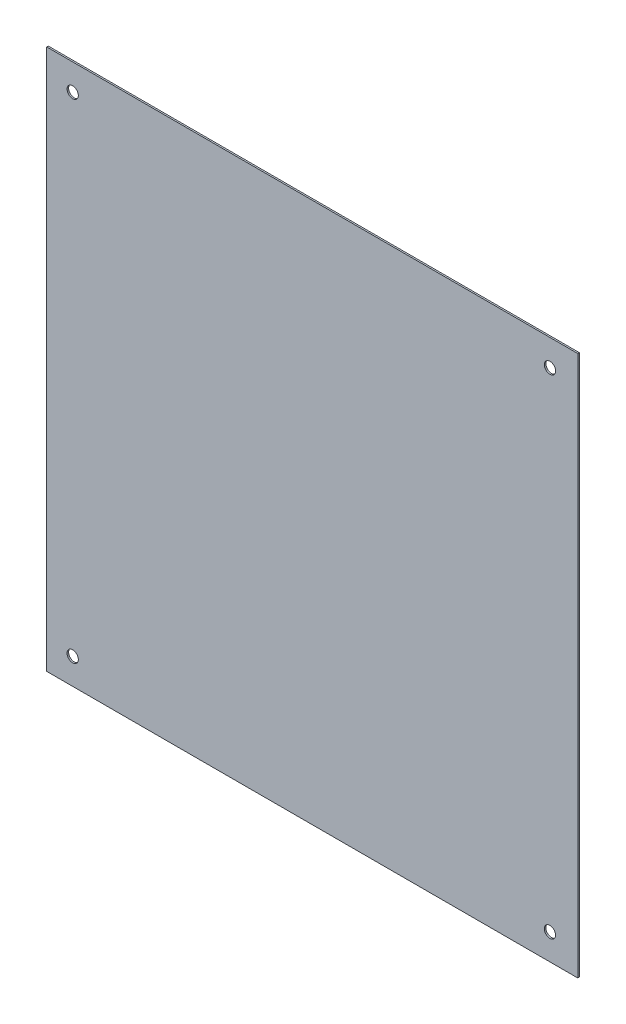
ISO-10303-21;
HEADER;
FILE_DESCRIPTION(('STEP AP214'),'2;1');
FILE_NAME('part.step','',(''),(''),'','','');
FILE_SCHEMA(('AUTOMOTIVE_DESIGN { 1 0 10303 214 1 1 1 1 }'));
ENDSEC;
DATA;
#1=APPLICATION_CONTEXT('core data for automotive mechanical design processes');
#2=APPLICATION_PROTOCOL_DEFINITION('international standard','automotive_design',2000,#1);
#3=PRODUCT_CONTEXT('',#1,'mechanical');
#4=PRODUCT('Part','Part','',(#3));
#5=PRODUCT_RELATED_PRODUCT_CATEGORY('part','',(#4));
#6=PRODUCT_DEFINITION_FORMATION('','',#4);
#7=PRODUCT_DEFINITION_CONTEXT('part definition',#1,'design');
#8=PRODUCT_DEFINITION('design','',#6,#7);
#9=PRODUCT_DEFINITION_SHAPE('','',#8);
#10=(LENGTH_UNIT() NAMED_UNIT(*) SI_UNIT(.MILLI.,.METRE.));
#11=(NAMED_UNIT(*) PLANE_ANGLE_UNIT() SI_UNIT($,.RADIAN.));
#12=(NAMED_UNIT(*) SI_UNIT($,.STERADIAN.) SOLID_ANGLE_UNIT());
#13=UNCERTAINTY_MEASURE_WITH_UNIT(LENGTH_MEASURE(1.E-05),#10,'distance_accuracy_value','');
#14=(GEOMETRIC_REPRESENTATION_CONTEXT(3) GLOBAL_UNCERTAINTY_ASSIGNED_CONTEXT((#13)) GLOBAL_UNIT_ASSIGNED_CONTEXT((#10,
#11,#12)) REPRESENTATION_CONTEXT('',''));
#15=CARTESIAN_POINT('',(0.,0.,0.));
#16=DIRECTION('',(0.,0.,1.));
#17=DIRECTION('',(1.,0.,0.));
#18=AXIS2_PLACEMENT_3D('',#15,#16,#17);
#19=CARTESIAN_POINT('',(70.738996397704,72.034498106688,0.));
#20=DIRECTION('',(0.,0.,-1.));
#21=DIRECTION('',(0.,-1.,0.));
#22=AXIS2_PLACEMENT_3D('',#19,#20,#21);
#23=PLANE('',#22);
#24=CARTESIAN_POINT('',(134.,137.,0.));
#25=DIRECTION('',(0.,0.,1.));
#26=DIRECTION('',(1.,0.,0.));
#27=AXIS2_PLACEMENT_3D('',#24,#25,#26);
#28=CIRCLE('',#27,1.5);
#29=CARTESIAN_POINT('',(135.5,137.,0.));
#30=VERTEX_POINT('',#29);
#31=EDGE_CURVE('E26',#30,#30,#28,.T.);
#32=ORIENTED_EDGE('',*,*,#31,.F.);
#33=EDGE_LOOP('',(#32));
#34=FACE_BOUND('',#33,.T.);
#35=CARTESIAN_POINT('',(134.,7.,0.));
#36=DIRECTION('',(0.,0.,1.));
#37=DIRECTION('',(1.,0.,0.));
#38=AXIS2_PLACEMENT_3D('',#35,#36,#37);
#39=CIRCLE('',#38,1.5);
#40=CARTESIAN_POINT('',(135.5,7.,0.));
#41=VERTEX_POINT('',#40);
#42=EDGE_CURVE('E128',#41,#41,#39,.T.);
#43=ORIENTED_EDGE('',*,*,#42,.F.);
#44=EDGE_LOOP('',(#43));
#45=FACE_BOUND('',#44,.T.);
#46=CARTESIAN_POINT('',(7.,137.,0.));
#47=DIRECTION('',(0.,0.,1.));
#48=DIRECTION('',(1.,0.,0.));
#49=AXIS2_PLACEMENT_3D('',#46,#47,#48);
#50=CIRCLE('',#49,1.5);
#51=CARTESIAN_POINT('',(8.5,137.,0.));
#52=VERTEX_POINT('',#51);
#53=EDGE_CURVE('E118',#52,#52,#50,.T.);
#54=ORIENTED_EDGE('',*,*,#53,.F.);
#55=EDGE_LOOP('',(#54));
#56=FACE_BOUND('',#55,.T.);
#57=CARTESIAN_POINT('',(7.,7.,0.));
#58=DIRECTION('',(0.,0.,1.));
#59=DIRECTION('',(1.,0.,0.));
#60=AXIS2_PLACEMENT_3D('',#57,#58,#59);
#61=CIRCLE('',#60,1.5);
#62=CARTESIAN_POINT('',(8.5,7.,0.));
#63=VERTEX_POINT('',#62);
#64=EDGE_CURVE('E110',#63,#63,#61,.T.);
#65=ORIENTED_EDGE('',*,*,#64,.F.);
#66=EDGE_LOOP('',(#65));
#67=FACE_BOUND('',#66,.T.);
#68=DIRECTION('',(0.,1.,0.));
#69=VECTOR('',#68,1.);
#70=CARTESIAN_POINT('',(0.07599999755621,0.07599999755621,0.));
#71=LINE('',#70,#69);
#72=CARTESIAN_POINT('',(0.07599999755621,0.07599999755621,0.));
#73=VERTEX_POINT('',#72);
#74=CARTESIAN_POINT('',(0.07599999755621,46.049999237061,0.));
#75=VERTEX_POINT('',#74);
#76=EDGE_CURVE('E169',#73,#75,#71,.T.);
#77=ORIENTED_EDGE('',*,*,#76,.F.);
#78=DIRECTION('',(-1.,0.,0.));
#79=VECTOR('',#78,1.);
#80=CARTESIAN_POINT('',(141.40199279785,0.07599999755621,0.));
#81=LINE('',#80,#79);
#82=CARTESIAN_POINT('',(141.40199279785,0.07599999755621,0.));
#83=VERTEX_POINT('',#82);
#84=EDGE_CURVE('E155',#83,#73,#81,.T.);
#85=ORIENTED_EDGE('',*,*,#84,.F.);
#86=DIRECTION('',(0.,-1.,0.));
#87=VECTOR('',#86,1.);
#88=CARTESIAN_POINT('',(141.40199279785,143.99299621582,0.));
#89=LINE('',#88,#87);
#90=CARTESIAN_POINT('',(141.40199279785,143.99299621582,0.));
#91=VERTEX_POINT('',#90);
#92=EDGE_CURVE('E140',#91,#83,#89,.T.);
#93=ORIENTED_EDGE('',*,*,#92,.F.);
#94=DIRECTION('',(1.,0.,0.));
#95=VECTOR('',#94,1.);
#96=CARTESIAN_POINT('',(0.07599999755621,143.99299621582,0.));
#97=LINE('',#96,#95);
#98=CARTESIAN_POINT('',(0.07599999755621,143.99299621582,0.));
#99=VERTEX_POINT('',#98);
#100=EDGE_CURVE('E177',#99,#91,#97,.T.);
#101=ORIENTED_EDGE('',*,*,#100,.F.);
#102=DIRECTION('',(0.,1.,0.));
#103=VECTOR('',#102,1.);
#104=CARTESIAN_POINT('',(0.07599999755621,46.049999237061,0.));
#105=LINE('',#104,#103);
#106=EDGE_CURVE('E145',#75,#99,#105,.T.);
#107=ORIENTED_EDGE('',*,*,#106,.F.);
#108=EDGE_LOOP('',(#77,#85,#93,#101,#107));
#109=FACE_BOUND('',#108,.T.);
#110=ADVANCED_FACE('F15',(#34,#45,#56,#67,#109),#23,.F.);
#111=CARTESIAN_POINT('',(70.738996397704,72.034498106688,-0.41148));
#112=DIRECTION('',(0.,0.,-1.));
#113=DIRECTION('',(0.,-1.,0.));
#114=AXIS2_PLACEMENT_3D('',#111,#112,#113);
#115=PLANE('',#114);
#116=CARTESIAN_POINT('',(134.,137.,-0.41148));
#117=DIRECTION('',(0.,0.,1.));
#118=DIRECTION('',(1.,0.,0.));
#119=AXIS2_PLACEMENT_3D('',#116,#117,#118);
#120=CIRCLE('',#119,1.5);
#121=CARTESIAN_POINT('',(135.5,137.,-0.41148));
#122=VERTEX_POINT('',#121);
#123=EDGE_CURVE('E10',#122,#122,#120,.T.);
#124=ORIENTED_EDGE('',*,*,#123,.T.);
#125=EDGE_LOOP('',(#124));
#126=FACE_BOUND('',#125,.T.);
#127=CARTESIAN_POINT('',(134.,7.,-0.41148));
#128=DIRECTION('',(0.,0.,1.));
#129=DIRECTION('',(1.,0.,0.));
#130=AXIS2_PLACEMENT_3D('',#127,#128,#129);
#131=CIRCLE('',#130,1.5);
#132=CARTESIAN_POINT('',(135.5,7.,-0.41148));
#133=VERTEX_POINT('',#132);
#134=EDGE_CURVE('E131',#133,#133,#131,.T.);
#135=ORIENTED_EDGE('',*,*,#134,.T.);
#136=EDGE_LOOP('',(#135));
#137=FACE_BOUND('',#136,.T.);
#138=CARTESIAN_POINT('',(7.,137.,-0.41148));
#139=DIRECTION('',(0.,0.,1.));
#140=DIRECTION('',(1.,0.,0.));
#141=AXIS2_PLACEMENT_3D('',#138,#139,#140);
#142=CIRCLE('',#141,1.5);
#143=CARTESIAN_POINT('',(8.5,137.,-0.41148));
#144=VERTEX_POINT('',#143);
#145=EDGE_CURVE('E124',#144,#144,#142,.T.);
#146=ORIENTED_EDGE('',*,*,#145,.T.);
#147=EDGE_LOOP('',(#146));
#148=FACE_BOUND('',#147,.T.);
#149=CARTESIAN_POINT('',(7.,7.,-0.41148));
#150=DIRECTION('',(0.,0.,1.));
#151=DIRECTION('',(1.,0.,0.));
#152=AXIS2_PLACEMENT_3D('',#149,#150,#151);
#153=CIRCLE('',#152,1.5);
#154=CARTESIAN_POINT('',(8.5,7.,-0.41148));
#155=VERTEX_POINT('',#154);
#156=EDGE_CURVE('E102',#155,#155,#153,.T.);
#157=ORIENTED_EDGE('',*,*,#156,.T.);
#158=EDGE_LOOP('',(#157));
#159=FACE_BOUND('',#158,.T.);
#160=DIRECTION('',(0.,1.,0.));
#161=VECTOR('',#160,1.);
#162=CARTESIAN_POINT('',(0.07599999755621,46.049999237061,-0.41148));
#163=LINE('',#162,#161);
#164=CARTESIAN_POINT('',(0.07599999755621,46.049999237061,-0.41148));
#165=VERTEX_POINT('',#164);
#166=CARTESIAN_POINT('',(0.07599999755621,143.99299621582,-0.41148));
#167=VERTEX_POINT('',#166);
#168=EDGE_CURVE('E180',#165,#167,#163,.T.);
#169=ORIENTED_EDGE('',*,*,#168,.T.);
#170=DIRECTION('',(1.,0.,0.));
#171=VECTOR('',#170,1.);
#172=CARTESIAN_POINT('',(0.07599999755621,143.99299621582,-0.41148));
#173=LINE('',#172,#171);
#174=CARTESIAN_POINT('',(141.40199279785,143.99299621582,-0.41148));
#175=VERTEX_POINT('',#174);
#176=EDGE_CURVE('E168',#167,#175,#173,.T.);
#177=ORIENTED_EDGE('',*,*,#176,.T.);
#178=DIRECTION('',(0.,-1.,0.));
#179=VECTOR('',#178,1.);
#180=CARTESIAN_POINT('',(141.40199279785,143.99299621582,-0.41148));
#181=LINE('',#180,#179);
#182=CARTESIAN_POINT('',(141.40199279785,0.07599999755621,-0.41148));
#183=VERTEX_POINT('',#182);
#184=EDGE_CURVE('E139',#175,#183,#181,.T.);
#185=ORIENTED_EDGE('',*,*,#184,.T.);
#186=DIRECTION('',(-1.,0.,0.));
#187=VECTOR('',#186,1.);
#188=CARTESIAN_POINT('',(141.40199279785,0.07599999755621,-0.41148));
#189=LINE('',#188,#187);
#190=CARTESIAN_POINT('',(0.07599999755621,0.07599999755621,-0.41148));
#191=VERTEX_POINT('',#190);
#192=EDGE_CURVE('E154',#183,#191,#189,.T.);
#193=ORIENTED_EDGE('',*,*,#192,.T.);
#194=DIRECTION('',(0.,1.,0.));
#195=VECTOR('',#194,1.);
#196=CARTESIAN_POINT('',(0.07599999755621,0.07599999755621,-0.41148));
#197=LINE('',#196,#195);
#198=EDGE_CURVE('E19',#191,#165,#197,.T.);
#199=ORIENTED_EDGE('',*,*,#198,.T.);
#200=EDGE_LOOP('',(#169,#177,#185,#193,#199));
#201=FACE_BOUND('',#200,.T.);
#202=ADVANCED_FACE('F103',(#126,#137,#148,#159,#201),#115,.T.);
#203=CARTESIAN_POINT('',(134.,137.,-0.41148));
#204=DIRECTION('',(0.,0.,-1.));
#205=DIRECTION('',(1.,0.,0.));
#206=AXIS2_PLACEMENT_3D('',#203,#204,#205);
#207=CYLINDRICAL_SURFACE('',#206,1.5);
#208=DIRECTION('',(0.,0.,1.));
#209=VECTOR('',#208,1.);
#210=CARTESIAN_POINT('',(135.5,137.,-0.41148));
#211=LINE('',#210,#209);
#212=EDGE_CURVE('E134',#122,#30,#211,.T.);
#213=ORIENTED_EDGE('',*,*,#212,.T.);
#214=ORIENTED_EDGE('',*,*,#31,.T.);
#215=ORIENTED_EDGE('',*,*,#212,.F.);
#216=ORIENTED_EDGE('',*,*,#123,.F.);
#217=EDGE_LOOP('',(#213,#214,#215,#216));
#218=FACE_BOUND('',#217,.T.);
#219=ADVANCED_FACE('F249',(#218),#207,.F.);
#220=CARTESIAN_POINT('',(134.,7.,-0.41148));
#221=DIRECTION('',(0.,0.,-1.));
#222=DIRECTION('',(1.,0.,0.));
#223=AXIS2_PLACEMENT_3D('',#220,#221,#222);
#224=CYLINDRICAL_SURFACE('',#223,1.5);
#225=DIRECTION('',(0.,0.,1.));
#226=VECTOR('',#225,1.);
#227=CARTESIAN_POINT('',(135.5,7.,-0.41148));
#228=LINE('',#227,#226);
#229=EDGE_CURVE('E127',#133,#41,#228,.T.);
#230=ORIENTED_EDGE('',*,*,#229,.T.);
#231=ORIENTED_EDGE('',*,*,#42,.T.);
#232=ORIENTED_EDGE('',*,*,#229,.F.);
#233=ORIENTED_EDGE('',*,*,#134,.F.);
#234=EDGE_LOOP('',(#230,#231,#232,#233));
#235=FACE_BOUND('',#234,.T.);
#236=ADVANCED_FACE('F211',(#235),#224,.F.);
#237=CARTESIAN_POINT('',(7.,137.,-0.41148));
#238=DIRECTION('',(0.,0.,-1.));
#239=DIRECTION('',(1.,0.,0.));
#240=AXIS2_PLACEMENT_3D('',#237,#238,#239);
#241=CYLINDRICAL_SURFACE('',#240,1.5);
#242=DIRECTION('',(0.,0.,1.));
#243=VECTOR('',#242,1.);
#244=CARTESIAN_POINT('',(8.5,137.,-0.41148));
#245=LINE('',#244,#243);
#246=EDGE_CURVE('E109',#144,#52,#245,.T.);
#247=ORIENTED_EDGE('',*,*,#246,.T.);
#248=ORIENTED_EDGE('',*,*,#53,.T.);
#249=ORIENTED_EDGE('',*,*,#246,.F.);
#250=ORIENTED_EDGE('',*,*,#145,.F.);
#251=EDGE_LOOP('',(#247,#248,#249,#250));
#252=FACE_BOUND('',#251,.T.);
#253=ADVANCED_FACE('F246',(#252),#241,.F.);
#254=CARTESIAN_POINT('',(7.,7.,-0.41148));
#255=DIRECTION('',(0.,0.,-1.));
#256=DIRECTION('',(1.,0.,0.));
#257=AXIS2_PLACEMENT_3D('',#254,#255,#256);
#258=CYLINDRICAL_SURFACE('',#257,1.5);
#259=DIRECTION('',(0.,0.,1.));
#260=VECTOR('',#259,1.);
#261=CARTESIAN_POINT('',(8.5,7.,-0.41148));
#262=LINE('',#261,#260);
#263=EDGE_CURVE('E120',#155,#63,#262,.T.);
#264=ORIENTED_EDGE('',*,*,#263,.T.);
#265=ORIENTED_EDGE('',*,*,#64,.T.);
#266=ORIENTED_EDGE('',*,*,#263,.F.);
#267=ORIENTED_EDGE('',*,*,#156,.F.);
#268=EDGE_LOOP('',(#264,#265,#266,#267));
#269=FACE_BOUND('',#268,.T.);
#270=ADVANCED_FACE('F243',(#269),#258,.F.);
#271=CARTESIAN_POINT('',(0.07599999755621,0.07599999755621,-0.41148));
#272=DIRECTION('',(-1.,0.,0.));
#273=DIRECTION('',(0.,0.,1.));
#274=AXIS2_PLACEMENT_3D('',#271,#272,#273);
#275=PLANE('',#274);
#276=DIRECTION('',(0.,0.,1.));
#277=VECTOR('',#276,1.);
#278=CARTESIAN_POINT('',(0.07599999755621,0.07599999755621,-0.41148));
#279=LINE('',#278,#277);
#280=EDGE_CURVE('E150',#191,#73,#279,.T.);
#281=ORIENTED_EDGE('',*,*,#280,.T.);
#282=ORIENTED_EDGE('',*,*,#76,.T.);
#283=DIRECTION('',(0.,0.,1.));
#284=VECTOR('',#283,1.);
#285=CARTESIAN_POINT('',(0.07599999755621,46.049999237061,-0.41148));
#286=LINE('',#285,#284);
#287=EDGE_CURVE('E141',#165,#75,#286,.T.);
#288=ORIENTED_EDGE('',*,*,#287,.F.);
#289=ORIENTED_EDGE('',*,*,#198,.F.);
#290=EDGE_LOOP('',(#281,#282,#288,#289));
#291=FACE_BOUND('',#290,.T.);
#292=ADVANCED_FACE('F225',(#291),#275,.T.);
#293=CARTESIAN_POINT('',(141.40199279785,0.07599999755621,-0.41148));
#294=DIRECTION('',(0.,-1.,0.));
#295=DIRECTION('',(0.,0.,-1.));
#296=AXIS2_PLACEMENT_3D('',#293,#294,#295);
#297=PLANE('',#296);
#298=DIRECTION('',(0.,0.,1.));
#299=VECTOR('',#298,1.);
#300=CARTESIAN_POINT('',(141.40199279785,0.07599999755621,-0.41148));
#301=LINE('',#300,#299);
#302=EDGE_CURVE('E135',#183,#83,#301,.T.);
#303=ORIENTED_EDGE('',*,*,#302,.T.);
#304=ORIENTED_EDGE('',*,*,#84,.T.);
#305=ORIENTED_EDGE('',*,*,#280,.F.);
#306=ORIENTED_EDGE('',*,*,#192,.F.);
#307=EDGE_LOOP('',(#303,#304,#305,#306));
#308=FACE_BOUND('',#307,.T.);
#309=ADVANCED_FACE('F229',(#308),#297,.T.);
#310=CARTESIAN_POINT('',(141.40199279785,143.99299621582,-0.41148));
#311=DIRECTION('',(1.,0.,0.));
#312=DIRECTION('',(0.,1.,0.));
#313=AXIS2_PLACEMENT_3D('',#310,#311,#312);
#314=PLANE('',#313);
#315=DIRECTION('',(0.,0.,1.));
#316=VECTOR('',#315,1.);
#317=CARTESIAN_POINT('',(141.40199279785,143.99299621582,-0.41148));
#318=LINE('',#317,#316);
#319=EDGE_CURVE('E176',#175,#91,#318,.T.);
#320=ORIENTED_EDGE('',*,*,#319,.T.);
#321=ORIENTED_EDGE('',*,*,#92,.T.);
#322=ORIENTED_EDGE('',*,*,#302,.F.);
#323=ORIENTED_EDGE('',*,*,#184,.F.);
#324=EDGE_LOOP('',(#320,#321,#322,#323));
#325=FACE_BOUND('',#324,.T.);
#326=ADVANCED_FACE('F17',(#325),#314,.T.);
#327=CARTESIAN_POINT('',(0.07599999755621,143.99299621582,-0.41148));
#328=DIRECTION('',(0.,1.,0.));
#329=DIRECTION('',(1.,0.,0.));
#330=AXIS2_PLACEMENT_3D('',#327,#328,#329);
#331=PLANE('',#330);
#332=DIRECTION('',(0.,0.,1.));
#333=VECTOR('',#332,1.);
#334=CARTESIAN_POINT('',(0.07599999755621,143.99299621582,-0.41148));
#335=LINE('',#334,#333);
#336=EDGE_CURVE('E149',#167,#99,#335,.T.);
#337=ORIENTED_EDGE('',*,*,#336,.T.);
#338=ORIENTED_EDGE('',*,*,#100,.T.);
#339=ORIENTED_EDGE('',*,*,#319,.F.);
#340=ORIENTED_EDGE('',*,*,#176,.F.);
#341=EDGE_LOOP('',(#337,#338,#339,#340));
#342=FACE_BOUND('',#341,.T.);
#343=ADVANCED_FACE('F232',(#342),#331,.T.);
#344=CARTESIAN_POINT('',(0.07599999755621,46.049999237061,-0.41148));
#345=DIRECTION('',(-1.,0.,0.));
#346=DIRECTION('',(0.,0.,1.));
#347=AXIS2_PLACEMENT_3D('',#344,#345,#346);
#348=PLANE('',#347);
#349=ORIENTED_EDGE('',*,*,#287,.T.);
#350=ORIENTED_EDGE('',*,*,#106,.T.);
#351=ORIENTED_EDGE('',*,*,#336,.F.);
#352=ORIENTED_EDGE('',*,*,#168,.F.);
#353=EDGE_LOOP('',(#349,#350,#351,#352));
#354=FACE_BOUND('',#353,.T.);
#355=ADVANCED_FACE('F234',(#354),#348,.T.);
#356=CLOSED_SHELL('',(#110,#202,#219,#236,#253,#270,#292,#309,#326,#343,#355));
#357=MANIFOLD_SOLID_BREP('B1',#356);
#358=ADVANCED_BREP_SHAPE_REPRESENTATION('',(#18,#357),#14);
#359=SHAPE_DEFINITION_REPRESENTATION(#9,#358);
ENDSEC;
END-ISO-10303-21;
